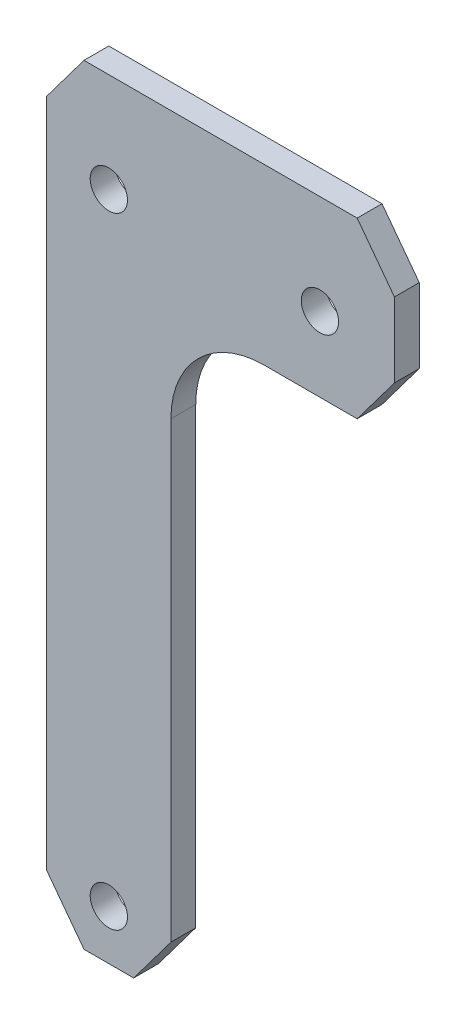
ISO-10303-21;
HEADER;
FILE_DESCRIPTION(('STEP AP214'),'2;1');
FILE_NAME('part.step','',(''),(''),'','','');
FILE_SCHEMA(('AUTOMOTIVE_DESIGN { 1 0 10303 214 1 1 1 1 }'));
ENDSEC;
DATA;
#1=APPLICATION_CONTEXT('core data for automotive mechanical design processes');
#2=APPLICATION_PROTOCOL_DEFINITION('international standard','automotive_design',2000,#1);
#3=PRODUCT_CONTEXT('',#1,'mechanical');
#4=PRODUCT('Part','Part','',(#3));
#5=PRODUCT_RELATED_PRODUCT_CATEGORY('part','',(#4));
#6=PRODUCT_DEFINITION_FORMATION('','',#4);
#7=PRODUCT_DEFINITION_CONTEXT('part definition',#1,'design');
#8=PRODUCT_DEFINITION('design','',#6,#7);
#9=PRODUCT_DEFINITION_SHAPE('','',#8);
#10=(LENGTH_UNIT() NAMED_UNIT(*) SI_UNIT(.MILLI.,.METRE.));
#11=(NAMED_UNIT(*) PLANE_ANGLE_UNIT() SI_UNIT($,.RADIAN.));
#12=(NAMED_UNIT(*) SI_UNIT($,.STERADIAN.) SOLID_ANGLE_UNIT());
#13=UNCERTAINTY_MEASURE_WITH_UNIT(LENGTH_MEASURE(1.E-05),#10,'distance_accuracy_value','');
#14=(GEOMETRIC_REPRESENTATION_CONTEXT(3) GLOBAL_UNCERTAINTY_ASSIGNED_CONTEXT((#13)) GLOBAL_UNIT_ASSIGNED_CONTEXT((#10,
#11,#12)) REPRESENTATION_CONTEXT('',''));
#15=CARTESIAN_POINT('',(0.,0.,0.));
#16=DIRECTION('',(0.,0.,1.));
#17=DIRECTION('',(1.,0.,0.));
#18=AXIS2_PLACEMENT_3D('',#15,#16,#17);
#19=CARTESIAN_POINT('',(10.,-14.,-2.));
#20=DIRECTION('',(0.,-1.,0.));
#21=DIRECTION('',(1.,0.,0.));
#22=AXIS2_PLACEMENT_3D('',#19,#20,#21);
#23=PLANE('',#22);
#24=DIRECTION('',(1.,0.,0.));
#25=VECTOR('',#24,1.);
#26=CARTESIAN_POINT('',(10.,-14.,0.));
#27=LINE('',#26,#25);
#28=CARTESIAN_POINT('',(17.5,-14.,0.));
#29=VERTEX_POINT('',#28);
#30=CARTESIAN_POINT('',(25.,-14.,0.));
#31=VERTEX_POINT('',#30);
#32=EDGE_CURVE('E56',#29,#31,#27,.T.);
#33=ORIENTED_EDGE('',*,*,#32,.F.);
#34=DIRECTION('',(0.,0.,1.));
#35=VECTOR('',#34,1.);
#36=CARTESIAN_POINT('',(17.5,-14.,-2.));
#37=LINE('',#36,#35);
#38=CARTESIAN_POINT('',(17.5,-14.,-2.));
#39=VERTEX_POINT('',#38);
#40=EDGE_CURVE('E144',#39,#29,#37,.T.);
#41=ORIENTED_EDGE('',*,*,#40,.F.);
#42=DIRECTION('',(1.,0.,0.));
#43=VECTOR('',#42,1.);
#44=CARTESIAN_POINT('',(10.,-14.,-2.));
#45=LINE('',#44,#43);
#46=CARTESIAN_POINT('',(25.,-14.,-2.));
#47=VERTEX_POINT('',#46);
#48=EDGE_CURVE('E13',#39,#47,#45,.T.);
#49=ORIENTED_EDGE('',*,*,#48,.T.);
#50=DIRECTION('',(0.,0.,1.));
#51=VECTOR('',#50,1.);
#52=CARTESIAN_POINT('',(25.,-14.,-2.));
#53=LINE('',#52,#51);
#54=EDGE_CURVE('E173',#47,#31,#53,.T.);
#55=ORIENTED_EDGE('',*,*,#54,.T.);
#56=EDGE_LOOP('',(#33,#41,#49,#55));
#57=FACE_BOUND('',#56,.T.);
#58=ADVANCED_FACE('F52',(#57),#23,.T.);
#59=CARTESIAN_POINT('',(28.,-14.,-2.));
#60=DIRECTION('',(1.,0.,0.));
#61=DIRECTION('',(0.,0.,-1.));
#62=AXIS2_PLACEMENT_3D('',#59,#60,#61);
#63=PLANE('',#62);
#64=DIRECTION('',(0.,1.,0.));
#65=VECTOR('',#64,1.);
#66=CARTESIAN_POINT('',(28.,-14.,0.));
#67=LINE('',#66,#65);
#68=CARTESIAN_POINT('',(28.,-10.,0.));
#69=VERTEX_POINT('',#68);
#70=CARTESIAN_POINT('',(28.,-4.,0.));
#71=VERTEX_POINT('',#70);
#72=EDGE_CURVE('E186',#69,#71,#67,.T.);
#73=ORIENTED_EDGE('',*,*,#72,.F.);
#74=DIRECTION('',(0.,0.,1.));
#75=VECTOR('',#74,1.);
#76=CARTESIAN_POINT('',(28.,-10.,-2.));
#77=LINE('',#76,#75);
#78=CARTESIAN_POINT('',(28.,-10.,-2.));
#79=VERTEX_POINT('',#78);
#80=EDGE_CURVE('E168',#79,#69,#77,.T.);
#81=ORIENTED_EDGE('',*,*,#80,.F.);
#82=DIRECTION('',(0.,1.,0.));
#83=VECTOR('',#82,1.);
#84=CARTESIAN_POINT('',(28.,-14.,-2.));
#85=LINE('',#84,#83);
#86=CARTESIAN_POINT('',(28.,-4.,-2.));
#87=VERTEX_POINT('',#86);
#88=EDGE_CURVE('E164',#79,#87,#85,.T.);
#89=ORIENTED_EDGE('',*,*,#88,.T.);
#90=DIRECTION('',(0.,0.,1.));
#91=VECTOR('',#90,1.);
#92=CARTESIAN_POINT('',(28.,-4.,-2.));
#93=LINE('',#92,#91);
#94=EDGE_CURVE('E225',#87,#71,#93,.T.);
#95=ORIENTED_EDGE('',*,*,#94,.T.);
#96=EDGE_LOOP('',(#73,#81,#89,#95));
#97=FACE_BOUND('',#96,.T.);
#98=ADVANCED_FACE('F54',(#97),#63,.T.);
#99=CARTESIAN_POINT('',(10.,-62.,-2.));
#100=DIRECTION('',(1.,0.,0.));
#101=DIRECTION('',(0.,1.,0.));
#102=AXIS2_PLACEMENT_3D('',#99,#100,#101);
#103=PLANE('',#102);
#104=DIRECTION('',(0.,0.,1.));
#105=VECTOR('',#104,1.);
#106=CARTESIAN_POINT('',(10.,-21.5,-2.));
#107=LINE('',#106,#105);
#108=CARTESIAN_POINT('',(10.,-21.5,-2.));
#109=VERTEX_POINT('',#108);
#110=CARTESIAN_POINT('',(10.,-21.5,0.));
#111=VERTEX_POINT('',#110);
#112=EDGE_CURVE('E147',#109,#111,#107,.T.);
#113=ORIENTED_EDGE('',*,*,#112,.T.);
#114=DIRECTION('',(0.,1.,0.));
#115=VECTOR('',#114,1.);
#116=CARTESIAN_POINT('',(10.,-62.,0.));
#117=LINE('',#116,#115);
#118=CARTESIAN_POINT('',(10.,-58.,0.));
#119=VERTEX_POINT('',#118);
#120=EDGE_CURVE('E209',#119,#111,#117,.T.);
#121=ORIENTED_EDGE('',*,*,#120,.F.);
#122=DIRECTION('',(0.,0.,1.));
#123=VECTOR('',#122,1.);
#124=CARTESIAN_POINT('',(10.,-58.,-2.));
#125=LINE('',#124,#123);
#126=CARTESIAN_POINT('',(10.,-58.,-2.));
#127=VERTEX_POINT('',#126);
#128=EDGE_CURVE('E77',#127,#119,#125,.T.);
#129=ORIENTED_EDGE('',*,*,#128,.F.);
#130=DIRECTION('',(0.,1.,0.));
#131=VECTOR('',#130,1.);
#132=CARTESIAN_POINT('',(10.,-62.,-2.));
#133=LINE('',#132,#131);
#134=EDGE_CURVE('E61',#127,#109,#133,.T.);
#135=ORIENTED_EDGE('',*,*,#134,.T.);
#136=EDGE_LOOP('',(#113,#121,#129,#135));
#137=FACE_BOUND('',#136,.T.);
#138=ADVANCED_FACE('F263',(#137),#103,.T.);
#139=CARTESIAN_POINT('',(0.,-62.,-2.));
#140=DIRECTION('',(0.,-1.,0.));
#141=DIRECTION('',(0.,0.,-1.));
#142=AXIS2_PLACEMENT_3D('',#139,#140,#141);
#143=PLANE('',#142);
#144=DIRECTION('',(1.,0.,0.));
#145=VECTOR('',#144,1.);
#146=CARTESIAN_POINT('',(0.,-62.,-2.));
#147=LINE('',#146,#145);
#148=CARTESIAN_POINT('',(3.,-62.,-2.));
#149=VERTEX_POINT('',#148);
#150=CARTESIAN_POINT('',(7.,-62.,-2.));
#151=VERTEX_POINT('',#150);
#152=EDGE_CURVE('E195',#149,#151,#147,.T.);
#153=ORIENTED_EDGE('',*,*,#152,.T.);
#154=DIRECTION('',(0.,0.,1.));
#155=VECTOR('',#154,1.);
#156=CARTESIAN_POINT('',(7.,-62.,-2.));
#157=LINE('',#156,#155);
#158=CARTESIAN_POINT('',(7.,-62.,0.));
#159=VERTEX_POINT('',#158);
#160=EDGE_CURVE('E242',#151,#159,#157,.T.);
#161=ORIENTED_EDGE('',*,*,#160,.T.);
#162=DIRECTION('',(1.,0.,0.));
#163=VECTOR('',#162,1.);
#164=CARTESIAN_POINT('',(0.,-62.,0.));
#165=LINE('',#164,#163);
#166=CARTESIAN_POINT('',(3.,-62.,0.));
#167=VERTEX_POINT('',#166);
#168=EDGE_CURVE('E207',#167,#159,#165,.T.);
#169=ORIENTED_EDGE('',*,*,#168,.F.);
#170=DIRECTION('',(0.,0.,1.));
#171=VECTOR('',#170,1.);
#172=CARTESIAN_POINT('',(3.,-62.,-2.));
#173=LINE('',#172,#171);
#174=EDGE_CURVE('E179',#149,#167,#173,.T.);
#175=ORIENTED_EDGE('',*,*,#174,.F.);
#176=EDGE_LOOP('',(#153,#161,#169,#175));
#177=FACE_BOUND('',#176,.T.);
#178=ADVANCED_FACE('F268',(#177),#143,.T.);
#179=CARTESIAN_POINT('',(0.,0.,-2.));
#180=DIRECTION('',(-1.,0.,0.));
#181=DIRECTION('',(0.,0.,1.));
#182=AXIS2_PLACEMENT_3D('',#179,#180,#181);
#183=PLANE('',#182);
#184=DIRECTION('',(0.,-1.,0.));
#185=VECTOR('',#184,1.);
#186=CARTESIAN_POINT('',(0.,0.,0.));
#187=LINE('',#186,#185);
#188=CARTESIAN_POINT('',(0.,-4.,0.));
#189=VERTEX_POINT('',#188);
#190=CARTESIAN_POINT('',(0.,-58.,0.));
#191=VERTEX_POINT('',#190);
#192=EDGE_CURVE('E204',#189,#191,#187,.T.);
#193=ORIENTED_EDGE('',*,*,#192,.F.);
#194=DIRECTION('',(0.,0.,1.));
#195=VECTOR('',#194,1.);
#196=CARTESIAN_POINT('',(0.,-4.,-2.));
#197=LINE('',#196,#195);
#198=CARTESIAN_POINT('',(0.,-4.,-2.));
#199=VERTEX_POINT('',#198);
#200=EDGE_CURVE('E227',#199,#189,#197,.T.);
#201=ORIENTED_EDGE('',*,*,#200,.F.);
#202=DIRECTION('',(0.,-1.,0.));
#203=VECTOR('',#202,1.);
#204=CARTESIAN_POINT('',(0.,0.,-2.));
#205=LINE('',#204,#203);
#206=CARTESIAN_POINT('',(0.,-58.,-2.));
#207=VERTEX_POINT('',#206);
#208=EDGE_CURVE('E192',#199,#207,#205,.T.);
#209=ORIENTED_EDGE('',*,*,#208,.T.);
#210=DIRECTION('',(0.,0.,1.));
#211=VECTOR('',#210,1.);
#212=CARTESIAN_POINT('',(0.,-58.,-2.));
#213=LINE('',#212,#211);
#214=EDGE_CURVE('E183',#207,#191,#213,.T.);
#215=ORIENTED_EDGE('',*,*,#214,.T.);
#216=EDGE_LOOP('',(#193,#201,#209,#215));
#217=FACE_BOUND('',#216,.T.);
#218=ADVANCED_FACE('F276',(#217),#183,.T.);
#219=CARTESIAN_POINT('',(28.,0.,-2.));
#220=DIRECTION('',(0.,1.,0.));
#221=DIRECTION('',(0.,0.,1.));
#222=AXIS2_PLACEMENT_3D('',#219,#220,#221);
#223=PLANE('',#222);
#224=DIRECTION('',(0.,0.,1.));
#225=VECTOR('',#224,1.);
#226=CARTESIAN_POINT('',(25.,0.,-2.));
#227=LINE('',#226,#225);
#228=CARTESIAN_POINT('',(25.,0.,-2.));
#229=VERTEX_POINT('',#228);
#230=CARTESIAN_POINT('',(25.,0.,0.));
#231=VERTEX_POINT('',#230);
#232=EDGE_CURVE('E171',#229,#231,#227,.T.);
#233=ORIENTED_EDGE('',*,*,#232,.F.);
#234=DIRECTION('',(-1.,0.,0.));
#235=VECTOR('',#234,1.);
#236=CARTESIAN_POINT('',(28.,0.,-2.));
#237=LINE('',#236,#235);
#238=CARTESIAN_POINT('',(3.,0.,-2.));
#239=VERTEX_POINT('',#238);
#240=EDGE_CURVE('E189',#229,#239,#237,.T.);
#241=ORIENTED_EDGE('',*,*,#240,.T.);
#242=DIRECTION('',(0.,0.,1.));
#243=VECTOR('',#242,1.);
#244=CARTESIAN_POINT('',(3.,0.,-2.));
#245=LINE('',#244,#243);
#246=CARTESIAN_POINT('',(3.,0.,0.));
#247=VERTEX_POINT('',#246);
#248=EDGE_CURVE('E234',#239,#247,#245,.T.);
#249=ORIENTED_EDGE('',*,*,#248,.T.);
#250=DIRECTION('',(-1.,0.,0.));
#251=VECTOR('',#250,1.);
#252=CARTESIAN_POINT('',(28.,0.,0.));
#253=LINE('',#252,#251);
#254=EDGE_CURVE('E201',#231,#247,#253,.T.);
#255=ORIENTED_EDGE('',*,*,#254,.F.);
#256=EDGE_LOOP('',(#233,#241,#249,#255));
#257=FACE_BOUND('',#256,.T.);
#258=ADVANCED_FACE('F283',(#257),#223,.T.);
#259=CARTESIAN_POINT('',(0.,0.,-2.));
#260=DIRECTION('',(0.,0.,1.));
#261=DIRECTION('',(1.,0.,0.));
#262=AXIS2_PLACEMENT_3D('',#259,#260,#261);
#263=PLANE('',#262);
#264=CARTESIAN_POINT('',(17.5,-21.5,-2.));
#265=DIRECTION('',(0.,0.,-1.));
#266=DIRECTION('',(1.,0.,0.));
#267=AXIS2_PLACEMENT_3D('',#264,#265,#266);
#268=CIRCLE('',#267,7.49999999999999);
#269=EDGE_CURVE('E141',#109,#39,#268,.T.);
#270=ORIENTED_EDGE('',*,*,#269,.F.);
#271=ORIENTED_EDGE('',*,*,#134,.F.);
#272=DIRECTION('',(0.600000000000001,0.8,0.));
#273=VECTOR('',#272,1.);
#274=CARTESIAN_POINT('',(34.24,-25.68,-2.));
#275=LINE('',#274,#273);
#276=EDGE_CURVE('E240',#151,#127,#275,.T.);
#277=ORIENTED_EDGE('',*,*,#276,.F.);
#278=ORIENTED_EDGE('',*,*,#152,.F.);
#279=DIRECTION('',(-0.6,0.8,0.));
#280=VECTOR('',#279,1.);
#281=CARTESIAN_POINT('',(-27.84,-20.88,-2.));
#282=LINE('',#281,#280);
#283=EDGE_CURVE('E176',#149,#207,#282,.T.);
#284=ORIENTED_EDGE('',*,*,#283,.T.);
#285=ORIENTED_EDGE('',*,*,#208,.F.);
#286=DIRECTION('',(-0.6,-0.8,0.));
#287=VECTOR('',#286,1.);
#288=CARTESIAN_POINT('',(1.92,-1.44,-2.));
#289=LINE('',#288,#287);
#290=EDGE_CURVE('E231',#239,#199,#289,.T.);
#291=ORIENTED_EDGE('',*,*,#290,.F.);
#292=ORIENTED_EDGE('',*,*,#240,.F.);
#293=DIRECTION('',(0.6,-0.8,0.));
#294=VECTOR('',#293,1.);
#295=CARTESIAN_POINT('',(25.,0.,-2.));
#296=LINE('',#295,#294);
#297=EDGE_CURVE('E222',#229,#87,#296,.T.);
#298=ORIENTED_EDGE('',*,*,#297,.T.);
#299=ORIENTED_EDGE('',*,*,#88,.F.);
#300=DIRECTION('',(0.6,0.8,0.));
#301=VECTOR('',#300,1.);
#302=CARTESIAN_POINT('',(25.,-14.,-2.));
#303=LINE('',#302,#301);
#304=EDGE_CURVE('E161',#47,#79,#303,.T.);
#305=ORIENTED_EDGE('',*,*,#304,.F.);
#306=ORIENTED_EDGE('',*,*,#48,.F.);
#307=EDGE_LOOP('',(#270,#271,#277,#278,#284,#285,#291,#292,#298,#299,#305,#306));
#308=FACE_BOUND('',#307,.T.);
#309=CARTESIAN_POINT('',(5.,-58.,-2.));
#310=DIRECTION('',(0.,0.,1.));
#311=DIRECTION('',(1.,0.,0.));
#312=AXIS2_PLACEMENT_3D('',#309,#310,#311);
#313=CIRCLE('',#312,1.5);
#314=CARTESIAN_POINT('',(6.5,-58.,-2.));
#315=VERTEX_POINT('',#314);
#316=EDGE_CURVE('E250',#315,#315,#313,.T.);
#317=ORIENTED_EDGE('',*,*,#316,.T.);
#318=EDGE_LOOP('',(#317));
#319=FACE_BOUND('',#318,.T.);
#320=CARTESIAN_POINT('',(22.,-8.00000000000001,-2.));
#321=DIRECTION('',(0.,0.,1.));
#322=DIRECTION('',(1.,0.,0.));
#323=AXIS2_PLACEMENT_3D('',#320,#321,#322);
#324=CIRCLE('',#323,1.5);
#325=CARTESIAN_POINT('',(23.5,-8.00000000000001,-2.));
#326=VERTEX_POINT('',#325);
#327=EDGE_CURVE('E256',#326,#326,#324,.T.);
#328=ORIENTED_EDGE('',*,*,#327,.T.);
#329=EDGE_LOOP('',(#328));
#330=FACE_BOUND('',#329,.T.);
#331=CARTESIAN_POINT('',(5.,-8.00000000000001,-2.));
#332=DIRECTION('',(0.,0.,1.));
#333=DIRECTION('',(1.,0.,0.));
#334=AXIS2_PLACEMENT_3D('',#331,#332,#333);
#335=CIRCLE('',#334,1.5);
#336=CARTESIAN_POINT('',(6.5,-8.00000000000001,-2.));
#337=VERTEX_POINT('',#336);
#338=EDGE_CURVE('E216',#337,#337,#335,.T.);
#339=ORIENTED_EDGE('',*,*,#338,.T.);
#340=EDGE_LOOP('',(#339));
#341=FACE_BOUND('',#340,.T.);
#342=ADVANCED_FACE('F158',(#308,#319,#330,#341),#263,.F.);
#343=CARTESIAN_POINT('',(0.,0.,0.));
#344=DIRECTION('',(0.,0.,1.));
#345=DIRECTION('',(1.,0.,0.));
#346=AXIS2_PLACEMENT_3D('',#343,#344,#345);
#347=PLANE('',#346);
#348=ORIENTED_EDGE('',*,*,#120,.T.);
#349=CARTESIAN_POINT('',(17.5,-21.5,0.));
#350=DIRECTION('',(0.,0.,-1.));
#351=DIRECTION('',(1.,0.,0.));
#352=AXIS2_PLACEMENT_3D('',#349,#350,#351);
#353=CIRCLE('',#352,7.49999999999999);
#354=EDGE_CURVE('E69',#111,#29,#353,.T.);
#355=ORIENTED_EDGE('',*,*,#354,.T.);
#356=ORIENTED_EDGE('',*,*,#32,.T.);
#357=DIRECTION('',(0.6,0.8,0.));
#358=VECTOR('',#357,1.);
#359=CARTESIAN_POINT('',(25.,-14.,0.));
#360=LINE('',#359,#358);
#361=EDGE_CURVE('E167',#31,#69,#360,.T.);
#362=ORIENTED_EDGE('',*,*,#361,.T.);
#363=ORIENTED_EDGE('',*,*,#72,.T.);
#364=DIRECTION('',(0.6,-0.8,0.));
#365=VECTOR('',#364,1.);
#366=CARTESIAN_POINT('',(25.,0.,0.));
#367=LINE('',#366,#365);
#368=EDGE_CURVE('E224',#231,#71,#367,.T.);
#369=ORIENTED_EDGE('',*,*,#368,.F.);
#370=ORIENTED_EDGE('',*,*,#254,.T.);
#371=DIRECTION('',(-0.6,-0.8,0.));
#372=VECTOR('',#371,1.);
#373=CARTESIAN_POINT('',(1.92,-1.44,0.));
#374=LINE('',#373,#372);
#375=EDGE_CURVE('E233',#247,#189,#374,.T.);
#376=ORIENTED_EDGE('',*,*,#375,.T.);
#377=ORIENTED_EDGE('',*,*,#192,.T.);
#378=DIRECTION('',(-0.6,0.8,0.));
#379=VECTOR('',#378,1.);
#380=CARTESIAN_POINT('',(-27.84,-20.88,0.));
#381=LINE('',#380,#379);
#382=EDGE_CURVE('E180',#167,#191,#381,.T.);
#383=ORIENTED_EDGE('',*,*,#382,.F.);
#384=ORIENTED_EDGE('',*,*,#168,.T.);
#385=DIRECTION('',(0.600000000000001,0.8,0.));
#386=VECTOR('',#385,1.);
#387=CARTESIAN_POINT('',(34.24,-25.68,0.));
#388=LINE('',#387,#386);
#389=EDGE_CURVE('E182',#159,#119,#388,.T.);
#390=ORIENTED_EDGE('',*,*,#389,.T.);
#391=EDGE_LOOP('',(#348,#355,#356,#362,#363,#369,#370,#376,#377,#383,#384,#390));
#392=FACE_BOUND('',#391,.T.);
#393=CARTESIAN_POINT('',(5.,-58.,0.));
#394=DIRECTION('',(0.,0.,1.));
#395=DIRECTION('',(1.,0.,0.));
#396=AXIS2_PLACEMENT_3D('',#393,#394,#395);
#397=CIRCLE('',#396,1.5);
#398=CARTESIAN_POINT('',(6.5,-58.,0.));
#399=VERTEX_POINT('',#398);
#400=EDGE_CURVE('E253',#399,#399,#397,.T.);
#401=ORIENTED_EDGE('',*,*,#400,.F.);
#402=EDGE_LOOP('',(#401));
#403=FACE_BOUND('',#402,.T.);
#404=CARTESIAN_POINT('',(22.,-8.00000000000001,0.));
#405=DIRECTION('',(0.,0.,1.));
#406=DIRECTION('',(1.,0.,0.));
#407=AXIS2_PLACEMENT_3D('',#404,#405,#406);
#408=CIRCLE('',#407,1.5);
#409=CARTESIAN_POINT('',(23.5,-8.00000000000001,0.));
#410=VERTEX_POINT('',#409);
#411=EDGE_CURVE('E248',#410,#410,#408,.T.);
#412=ORIENTED_EDGE('',*,*,#411,.F.);
#413=EDGE_LOOP('',(#412));
#414=FACE_BOUND('',#413,.T.);
#415=CARTESIAN_POINT('',(5.,-8.00000000000001,0.));
#416=DIRECTION('',(0.,0.,1.));
#417=DIRECTION('',(1.,0.,0.));
#418=AXIS2_PLACEMENT_3D('',#415,#416,#417);
#419=CIRCLE('',#418,1.5);
#420=CARTESIAN_POINT('',(6.5,-8.00000000000001,0.));
#421=VERTEX_POINT('',#420);
#422=EDGE_CURVE('E219',#421,#421,#419,.T.);
#423=ORIENTED_EDGE('',*,*,#422,.F.);
#424=EDGE_LOOP('',(#423));
#425=FACE_BOUND('',#424,.T.);
#426=ADVANCED_FACE('F212',(#392,#403,#414,#425),#347,.T.);
#427=CARTESIAN_POINT('',(-27.84,-20.88,-2.));
#428=DIRECTION('',(0.8,0.6,0.));
#429=DIRECTION('',(-0.6,0.8,0.));
#430=AXIS2_PLACEMENT_3D('',#427,#428,#429);
#431=PLANE('',#430);
#432=ORIENTED_EDGE('',*,*,#382,.T.);
#433=ORIENTED_EDGE('',*,*,#214,.F.);
#434=ORIENTED_EDGE('',*,*,#283,.F.);
#435=ORIENTED_EDGE('',*,*,#174,.T.);
#436=EDGE_LOOP('',(#432,#433,#434,#435));
#437=FACE_BOUND('',#436,.T.);
#438=ADVANCED_FACE('F272',(#437),#431,.F.);
#439=CARTESIAN_POINT('',(34.24,-25.68,-2.));
#440=DIRECTION('',(0.8,-0.600000000000001,0.));
#441=DIRECTION('',(0.600000000000001,0.8,0.));
#442=AXIS2_PLACEMENT_3D('',#439,#440,#441);
#443=PLANE('',#442);
#444=ORIENTED_EDGE('',*,*,#389,.F.);
#445=ORIENTED_EDGE('',*,*,#160,.F.);
#446=ORIENTED_EDGE('',*,*,#276,.T.);
#447=ORIENTED_EDGE('',*,*,#128,.T.);
#448=EDGE_LOOP('',(#444,#445,#446,#447));
#449=FACE_BOUND('',#448,.T.);
#450=ADVANCED_FACE('F314',(#449),#443,.T.);
#451=CARTESIAN_POINT('',(1.92,-1.44,-2.));
#452=DIRECTION('',(-0.8,0.6,0.));
#453=DIRECTION('',(-0.6,-0.8,0.));
#454=AXIS2_PLACEMENT_3D('',#451,#452,#453);
#455=PLANE('',#454);
#456=ORIENTED_EDGE('',*,*,#375,.F.);
#457=ORIENTED_EDGE('',*,*,#248,.F.);
#458=ORIENTED_EDGE('',*,*,#290,.T.);
#459=ORIENTED_EDGE('',*,*,#200,.T.);
#460=EDGE_LOOP('',(#456,#457,#458,#459));
#461=FACE_BOUND('',#460,.T.);
#462=ADVANCED_FACE('F320',(#461),#455,.T.);
#463=CARTESIAN_POINT('',(25.,0.,-2.));
#464=DIRECTION('',(-0.8,-0.6,0.));
#465=DIRECTION('',(0.6,-0.8,0.));
#466=AXIS2_PLACEMENT_3D('',#463,#464,#465);
#467=PLANE('',#466);
#468=ORIENTED_EDGE('',*,*,#368,.T.);
#469=ORIENTED_EDGE('',*,*,#94,.F.);
#470=ORIENTED_EDGE('',*,*,#297,.F.);
#471=ORIENTED_EDGE('',*,*,#232,.T.);
#472=EDGE_LOOP('',(#468,#469,#470,#471));
#473=FACE_BOUND('',#472,.T.);
#474=ADVANCED_FACE('F287',(#473),#467,.F.);
#475=CARTESIAN_POINT('',(25.,-14.,-2.));
#476=DIRECTION('',(0.8,-0.6,0.));
#477=DIRECTION('',(0.6,0.8,0.));
#478=AXIS2_PLACEMENT_3D('',#475,#476,#477);
#479=PLANE('',#478);
#480=ORIENTED_EDGE('',*,*,#361,.F.);
#481=ORIENTED_EDGE('',*,*,#54,.F.);
#482=ORIENTED_EDGE('',*,*,#304,.T.);
#483=ORIENTED_EDGE('',*,*,#80,.T.);
#484=EDGE_LOOP('',(#480,#481,#482,#483));
#485=FACE_BOUND('',#484,.T.);
#486=ADVANCED_FACE('F215',(#485),#479,.T.);
#487=CARTESIAN_POINT('',(5.,-8.00000000000001,-2.));
#488=DIRECTION('',(0.,0.,1.));
#489=DIRECTION('',(1.,0.,0.));
#490=AXIS2_PLACEMENT_3D('',#487,#488,#489);
#491=CYLINDRICAL_SURFACE('',#490,1.5);
#492=ORIENTED_EDGE('',*,*,#338,.F.);
#493=EDGE_LOOP('',(#492));
#494=FACE_BOUND('',#493,.T.);
#495=ORIENTED_EDGE('',*,*,#422,.T.);
#496=EDGE_LOOP('',(#495));
#497=FACE_BOUND('',#496,.T.);
#498=ADVANCED_FACE('F317',(#494,#497),#491,.F.);
#499=CARTESIAN_POINT('',(22.,-8.00000000000001,-2.));
#500=DIRECTION('',(0.,0.,1.));
#501=DIRECTION('',(1.,0.,0.));
#502=AXIS2_PLACEMENT_3D('',#499,#500,#501);
#503=CYLINDRICAL_SURFACE('',#502,1.5);
#504=ORIENTED_EDGE('',*,*,#327,.F.);
#505=EDGE_LOOP('',(#504));
#506=FACE_BOUND('',#505,.T.);
#507=ORIENTED_EDGE('',*,*,#411,.T.);
#508=EDGE_LOOP('',(#507));
#509=FACE_BOUND('',#508,.T.);
#510=ADVANCED_FACE('F327',(#506,#509),#503,.F.);
#511=CARTESIAN_POINT('',(5.,-58.,-2.));
#512=DIRECTION('',(0.,0.,1.));
#513=DIRECTION('',(1.,0.,0.));
#514=AXIS2_PLACEMENT_3D('',#511,#512,#513);
#515=CYLINDRICAL_SURFACE('',#514,1.5);
#516=ORIENTED_EDGE('',*,*,#316,.F.);
#517=EDGE_LOOP('',(#516));
#518=FACE_BOUND('',#517,.T.);
#519=ORIENTED_EDGE('',*,*,#400,.T.);
#520=EDGE_LOOP('',(#519));
#521=FACE_BOUND('',#520,.T.);
#522=ADVANCED_FACE('F329',(#518,#521),#515,.F.);
#523=CARTESIAN_POINT('',(17.5,-21.5,-2.));
#524=DIRECTION('',(0.,0.,1.));
#525=DIRECTION('',(1.,0.,0.));
#526=AXIS2_PLACEMENT_3D('',#523,#524,#525);
#527=CYLINDRICAL_SURFACE('',#526,7.49999999999999);
#528=ORIENTED_EDGE('',*,*,#354,.F.);
#529=ORIENTED_EDGE('',*,*,#112,.F.);
#530=ORIENTED_EDGE('',*,*,#269,.T.);
#531=ORIENTED_EDGE('',*,*,#40,.T.);
#532=EDGE_LOOP('',(#528,#529,#530,#531));
#533=FACE_BOUND('',#532,.T.);
#534=ADVANCED_FACE('F143',(#533),#527,.F.);
#535=CLOSED_SHELL('',(#58,#98,#138,#178,#218,#258,#342,#426,#438,#450,#462,#474,#486,#498,#510,
#522,#534));
#536=MANIFOLD_SOLID_BREP('B2',#535);
#537=ADVANCED_BREP_SHAPE_REPRESENTATION('',(#18,#536),#14);
#538=SHAPE_DEFINITION_REPRESENTATION(#9,#537);
ENDSEC;
END-ISO-10303-21;
